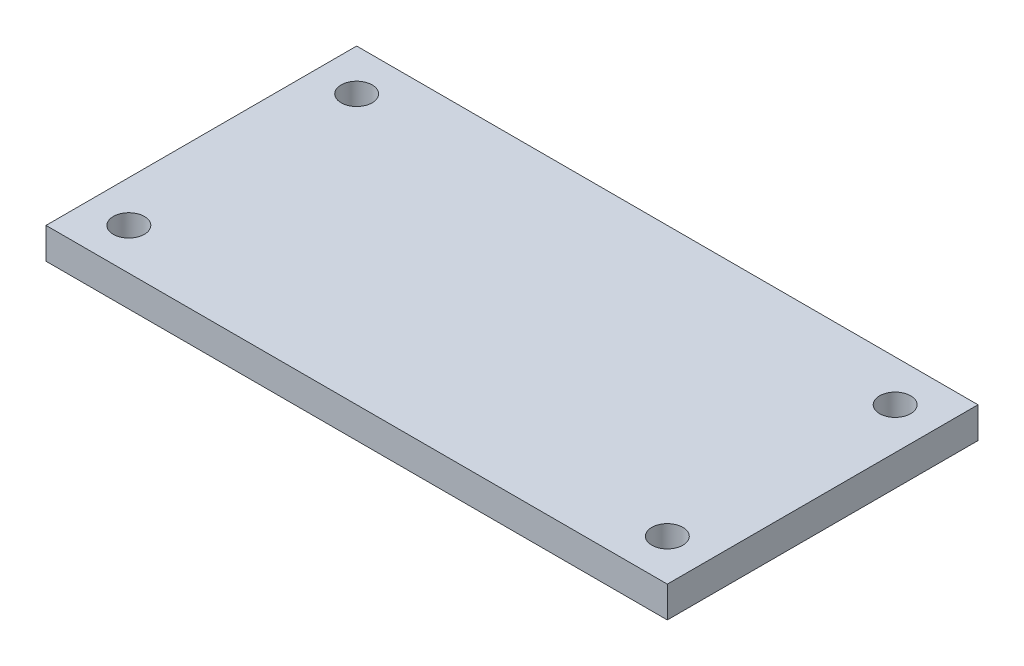
ISO-10303-21;
HEADER;
FILE_DESCRIPTION(('STEP AP214'),'2;1');
FILE_NAME('part.step','',(''),(''),'','','');
FILE_SCHEMA(('AUTOMOTIVE_DESIGN { 1 0 10303 214 1 1 1 1 }'));
ENDSEC;
DATA;
#1=APPLICATION_CONTEXT('core data for automotive mechanical design processes');
#2=APPLICATION_PROTOCOL_DEFINITION('international standard','automotive_design',2000,#1);
#3=PRODUCT_CONTEXT('',#1,'mechanical');
#4=PRODUCT('Part','Part','',(#3));
#5=PRODUCT_RELATED_PRODUCT_CATEGORY('part','',(#4));
#6=PRODUCT_DEFINITION_FORMATION('','',#4);
#7=PRODUCT_DEFINITION_CONTEXT('part definition',#1,'design');
#8=PRODUCT_DEFINITION('design','',#6,#7);
#9=PRODUCT_DEFINITION_SHAPE('','',#8);
#10=(LENGTH_UNIT() NAMED_UNIT(*) SI_UNIT(.MILLI.,.METRE.));
#11=(NAMED_UNIT(*) PLANE_ANGLE_UNIT() SI_UNIT($,.RADIAN.));
#12=(NAMED_UNIT(*) SI_UNIT($,.STERADIAN.) SOLID_ANGLE_UNIT());
#13=UNCERTAINTY_MEASURE_WITH_UNIT(LENGTH_MEASURE(1.E-05),#10,'distance_accuracy_value','');
#14=(GEOMETRIC_REPRESENTATION_CONTEXT(3) GLOBAL_UNCERTAINTY_ASSIGNED_CONTEXT((#13)) GLOBAL_UNIT_ASSIGNED_CONTEXT((#10,
#11,#12)) REPRESENTATION_CONTEXT('',''));
#15=CARTESIAN_POINT('',(0.,0.,0.));
#16=DIRECTION('',(0.,0.,1.));
#17=DIRECTION('',(1.,0.,0.));
#18=AXIS2_PLACEMENT_3D('',#15,#16,#17);
#19=CARTESIAN_POINT('',(0.,3.,0.));
#20=DIRECTION('',(0.,-1.,0.));
#21=DIRECTION('',(0.,0.,-1.));
#22=AXIS2_PLACEMENT_3D('',#19,#20,#21);
#23=PLANE('',#22);
#24=DIRECTION('',(0.,0.,1.));
#25=VECTOR('',#24,1.);
#26=CARTESIAN_POINT('',(-30.,3.,15.));
#27=LINE('',#26,#25);
#28=CARTESIAN_POINT('',(-30.,3.,-15.));
#29=VERTEX_POINT('',#28);
#30=CARTESIAN_POINT('',(-30.,3.,15.));
#31=VERTEX_POINT('',#30);
#32=EDGE_CURVE('E88',#29,#31,#27,.T.);
#33=ORIENTED_EDGE('',*,*,#32,.T.);
#34=DIRECTION('',(1.,0.,0.));
#35=VECTOR('',#34,1.);
#36=CARTESIAN_POINT('',(-14.2622950819648,3.,15.));
#37=LINE('',#36,#35);
#38=CARTESIAN_POINT('',(30.,3.,15.));
#39=VERTEX_POINT('',#38);
#40=EDGE_CURVE('E83',#31,#39,#37,.T.);
#41=ORIENTED_EDGE('',*,*,#40,.T.);
#42=DIRECTION('',(0.,0.,-1.));
#43=VECTOR('',#42,1.);
#44=CARTESIAN_POINT('',(30.,3.,0.));
#45=LINE('',#44,#43);
#46=CARTESIAN_POINT('',(30.,3.,-15.));
#47=VERTEX_POINT('',#46);
#48=EDGE_CURVE('E86',#39,#47,#45,.T.);
#49=ORIENTED_EDGE('',*,*,#48,.T.);
#50=DIRECTION('',(-1.,0.,0.));
#51=VECTOR('',#50,1.);
#52=CARTESIAN_POINT('',(0.,3.,-15.));
#53=LINE('',#52,#51);
#54=EDGE_CURVE('E55',#47,#29,#53,.T.);
#55=ORIENTED_EDGE('',*,*,#54,.T.);
#56=EDGE_LOOP('',(#33,#41,#49,#55));
#57=FACE_BOUND('',#56,.T.);
#58=CARTESIAN_POINT('',(-26.,3.,-11.));
#59=DIRECTION('',(0.,1.,0.));
#60=DIRECTION('',(0.,0.,1.));
#61=AXIS2_PLACEMENT_3D('',#58,#59,#60);
#62=CIRCLE('',#61,1.5);
#63=CARTESIAN_POINT('',(-26.,3.,-9.5));
#64=VERTEX_POINT('',#63);
#65=EDGE_CURVE('E104',#64,#64,#62,.T.);
#66=ORIENTED_EDGE('',*,*,#65,.F.);
#67=EDGE_LOOP('',(#66));
#68=FACE_BOUND('',#67,.T.);
#69=CARTESIAN_POINT('',(26.,3.,-11.));
#70=DIRECTION('',(0.,1.,0.));
#71=DIRECTION('',(0.,0.,-1.));
#72=AXIS2_PLACEMENT_3D('',#69,#70,#71);
#73=CIRCLE('',#72,1.5);
#74=CARTESIAN_POINT('',(26.,3.,-12.5));
#75=VERTEX_POINT('',#74);
#76=EDGE_CURVE('E138',#75,#75,#73,.T.);
#77=ORIENTED_EDGE('',*,*,#76,.F.);
#78=EDGE_LOOP('',(#77));
#79=FACE_BOUND('',#78,.T.);
#80=CARTESIAN_POINT('',(26.,3.,11.));
#81=DIRECTION('',(0.,1.,0.));
#82=DIRECTION('',(0.,0.,1.));
#83=AXIS2_PLACEMENT_3D('',#80,#81,#82);
#84=CIRCLE('',#83,1.5);
#85=CARTESIAN_POINT('',(26.,3.,12.5));
#86=VERTEX_POINT('',#85);
#87=EDGE_CURVE('E133',#86,#86,#84,.T.);
#88=ORIENTED_EDGE('',*,*,#87,.F.);
#89=EDGE_LOOP('',(#88));
#90=FACE_BOUND('',#89,.T.);
#91=CARTESIAN_POINT('',(-26.,3.,11.));
#92=DIRECTION('',(0.,1.,0.));
#93=DIRECTION('',(0.,0.,-1.));
#94=AXIS2_PLACEMENT_3D('',#91,#92,#93);
#95=CIRCLE('',#94,1.5);
#96=CARTESIAN_POINT('',(-26.,3.,9.5));
#97=VERTEX_POINT('',#96);
#98=EDGE_CURVE('E127',#97,#97,#95,.T.);
#99=ORIENTED_EDGE('',*,*,#98,.F.);
#100=EDGE_LOOP('',(#99));
#101=FACE_BOUND('',#100,.T.);
#102=ADVANCED_FACE('F38',(#57,#68,#79,#90,#101),#23,.F.);
#103=CARTESIAN_POINT('',(0.,0.,0.));
#104=DIRECTION('',(0.,-1.,0.));
#105=DIRECTION('',(0.,0.,-1.));
#106=AXIS2_PLACEMENT_3D('',#103,#104,#105);
#107=PLANE('',#106);
#108=CARTESIAN_POINT('',(26.,0.,11.));
#109=DIRECTION('',(0.,1.,0.));
#110=DIRECTION('',(0.,0.,1.));
#111=AXIS2_PLACEMENT_3D('',#108,#109,#110);
#112=CIRCLE('',#111,1.5);
#113=CARTESIAN_POINT('',(26.,0.,12.5));
#114=VERTEX_POINT('',#113);
#115=EDGE_CURVE('E130',#114,#114,#112,.T.);
#116=ORIENTED_EDGE('',*,*,#115,.T.);
#117=EDGE_LOOP('',(#116));
#118=FACE_BOUND('',#117,.T.);
#119=CARTESIAN_POINT('',(-26.,0.,-11.));
#120=DIRECTION('',(0.,1.,0.));
#121=DIRECTION('',(0.,0.,1.));
#122=AXIS2_PLACEMENT_3D('',#119,#120,#121);
#123=CIRCLE('',#122,1.5);
#124=CARTESIAN_POINT('',(-26.,0.,-9.5));
#125=VERTEX_POINT('',#124);
#126=EDGE_CURVE('E141',#125,#125,#123,.T.);
#127=ORIENTED_EDGE('',*,*,#126,.T.);
#128=EDGE_LOOP('',(#127));
#129=FACE_BOUND('',#128,.T.);
#130=DIRECTION('',(1.,0.,0.));
#131=VECTOR('',#130,1.);
#132=CARTESIAN_POINT('',(30.,0.,15.));
#133=LINE('',#132,#131);
#134=CARTESIAN_POINT('',(-30.,0.,15.));
#135=VERTEX_POINT('',#134);
#136=CARTESIAN_POINT('',(30.,0.,15.));
#137=VERTEX_POINT('',#136);
#138=EDGE_CURVE('E93',#135,#137,#133,.T.);
#139=ORIENTED_EDGE('',*,*,#138,.F.);
#140=DIRECTION('',(0.,0.,1.));
#141=VECTOR('',#140,1.);
#142=CARTESIAN_POINT('',(-30.,0.,0.));
#143=LINE('',#142,#141);
#144=CARTESIAN_POINT('',(-30.,0.,-15.));
#145=VERTEX_POINT('',#144);
#146=EDGE_CURVE('E107',#145,#135,#143,.T.);
#147=ORIENTED_EDGE('',*,*,#146,.F.);
#148=DIRECTION('',(-1.,0.,0.));
#149=VECTOR('',#148,1.);
#150=CARTESIAN_POINT('',(-30.,0.,-15.));
#151=LINE('',#150,#149);
#152=CARTESIAN_POINT('',(30.,0.,-15.));
#153=VERTEX_POINT('',#152);
#154=EDGE_CURVE('E71',#153,#145,#151,.T.);
#155=ORIENTED_EDGE('',*,*,#154,.F.);
#156=DIRECTION('',(0.,0.,-1.));
#157=VECTOR('',#156,1.);
#158=CARTESIAN_POINT('',(30.,0.,-15.));
#159=LINE('',#158,#157);
#160=EDGE_CURVE('E103',#137,#153,#159,.T.);
#161=ORIENTED_EDGE('',*,*,#160,.F.);
#162=EDGE_LOOP('',(#139,#147,#155,#161));
#163=FACE_BOUND('',#162,.T.);
#164=CARTESIAN_POINT('',(26.,0.,-11.));
#165=DIRECTION('',(0.,1.,0.));
#166=DIRECTION('',(0.,0.,-1.));
#167=AXIS2_PLACEMENT_3D('',#164,#165,#166);
#168=CIRCLE('',#167,1.5);
#169=CARTESIAN_POINT('',(26.,0.,-12.5));
#170=VERTEX_POINT('',#169);
#171=EDGE_CURVE('E122',#170,#170,#168,.T.);
#172=ORIENTED_EDGE('',*,*,#171,.T.);
#173=EDGE_LOOP('',(#172));
#174=FACE_BOUND('',#173,.T.);
#175=CARTESIAN_POINT('',(-26.,0.,11.));
#176=DIRECTION('',(0.,1.,0.));
#177=DIRECTION('',(0.,0.,-1.));
#178=AXIS2_PLACEMENT_3D('',#175,#176,#177);
#179=CIRCLE('',#178,1.5);
#180=CARTESIAN_POINT('',(-26.,0.,9.5));
#181=VERTEX_POINT('',#180);
#182=EDGE_CURVE('E125',#181,#181,#179,.T.);
#183=ORIENTED_EDGE('',*,*,#182,.T.);
#184=EDGE_LOOP('',(#183));
#185=FACE_BOUND('',#184,.T.);
#186=ADVANCED_FACE('F114',(#118,#129,#163,#174,#185),#107,.T.);
#187=CARTESIAN_POINT('',(30.,3.,15.));
#188=DIRECTION('',(0.,0.,-1.));
#189=DIRECTION('',(-1.,0.,0.));
#190=AXIS2_PLACEMENT_3D('',#187,#188,#189);
#191=PLANE('',#190);
#192=ORIENTED_EDGE('',*,*,#138,.T.);
#193=DIRECTION('',(0.,-1.,0.));
#194=VECTOR('',#193,1.);
#195=CARTESIAN_POINT('',(30.,3.,15.));
#196=LINE('',#195,#194);
#197=EDGE_CURVE('E47',#39,#137,#196,.T.);
#198=ORIENTED_EDGE('',*,*,#197,.F.);
#199=ORIENTED_EDGE('',*,*,#40,.F.);
#200=DIRECTION('',(0.,-1.,0.));
#201=VECTOR('',#200,1.);
#202=CARTESIAN_POINT('',(-30.,3.,15.));
#203=LINE('',#202,#201);
#204=EDGE_CURVE('E11',#31,#135,#203,.T.);
#205=ORIENTED_EDGE('',*,*,#204,.T.);
#206=EDGE_LOOP('',(#192,#198,#199,#205));
#207=FACE_BOUND('',#206,.T.);
#208=ADVANCED_FACE('F40',(#207),#191,.F.);
#209=CARTESIAN_POINT('',(30.,3.,-15.));
#210=DIRECTION('',(-1.,0.,0.));
#211=DIRECTION('',(0.,0.,1.));
#212=AXIS2_PLACEMENT_3D('',#209,#210,#211);
#213=PLANE('',#212);
#214=ORIENTED_EDGE('',*,*,#160,.T.);
#215=DIRECTION('',(0.,-1.,0.));
#216=VECTOR('',#215,1.);
#217=CARTESIAN_POINT('',(30.,3.,-15.));
#218=LINE('',#217,#216);
#219=EDGE_CURVE('E95',#47,#153,#218,.T.);
#220=ORIENTED_EDGE('',*,*,#219,.F.);
#221=ORIENTED_EDGE('',*,*,#48,.F.);
#222=ORIENTED_EDGE('',*,*,#197,.T.);
#223=EDGE_LOOP('',(#214,#220,#221,#222));
#224=FACE_BOUND('',#223,.T.);
#225=ADVANCED_FACE('F96',(#224),#213,.F.);
#226=CARTESIAN_POINT('',(-30.,3.,-15.));
#227=DIRECTION('',(0.,0.,1.));
#228=DIRECTION('',(1.,0.,0.));
#229=AXIS2_PLACEMENT_3D('',#226,#227,#228);
#230=PLANE('',#229);
#231=ORIENTED_EDGE('',*,*,#154,.T.);
#232=DIRECTION('',(0.,-1.,0.));
#233=VECTOR('',#232,1.);
#234=CARTESIAN_POINT('',(-30.,3.,-15.));
#235=LINE('',#234,#233);
#236=EDGE_CURVE('E98',#29,#145,#235,.T.);
#237=ORIENTED_EDGE('',*,*,#236,.F.);
#238=ORIENTED_EDGE('',*,*,#54,.F.);
#239=ORIENTED_EDGE('',*,*,#219,.T.);
#240=EDGE_LOOP('',(#231,#237,#238,#239));
#241=FACE_BOUND('',#240,.T.);
#242=ADVANCED_FACE('F111',(#241),#230,.F.);
#243=CARTESIAN_POINT('',(-30.,3.,0.));
#244=DIRECTION('',(1.,0.,0.));
#245=DIRECTION('',(0.,0.,-1.));
#246=AXIS2_PLACEMENT_3D('',#243,#244,#245);
#247=PLANE('',#246);
#248=ORIENTED_EDGE('',*,*,#146,.T.);
#249=ORIENTED_EDGE('',*,*,#204,.F.);
#250=ORIENTED_EDGE('',*,*,#32,.F.);
#251=ORIENTED_EDGE('',*,*,#236,.T.);
#252=EDGE_LOOP('',(#248,#249,#250,#251));
#253=FACE_BOUND('',#252,.T.);
#254=ADVANCED_FACE('F113',(#253),#247,.F.);
#255=CARTESIAN_POINT('',(-26.,3.,-11.));
#256=DIRECTION('',(0.,-1.,0.));
#257=DIRECTION('',(0.,0.,-1.));
#258=AXIS2_PLACEMENT_3D('',#255,#256,#257);
#259=CYLINDRICAL_SURFACE('',#258,1.5);
#260=ORIENTED_EDGE('',*,*,#65,.T.);
#261=EDGE_LOOP('',(#260));
#262=FACE_BOUND('',#261,.T.);
#263=ORIENTED_EDGE('',*,*,#126,.F.);
#264=EDGE_LOOP('',(#263));
#265=FACE_BOUND('',#264,.T.);
#266=ADVANCED_FACE('F149',(#262,#265),#259,.F.);
#267=CARTESIAN_POINT('',(26.,3.,-11.));
#268=DIRECTION('',(0.,-1.,0.));
#269=DIRECTION('',(0.,0.,-1.));
#270=AXIS2_PLACEMENT_3D('',#267,#268,#269);
#271=CYLINDRICAL_SURFACE('',#270,1.5);
#272=ORIENTED_EDGE('',*,*,#76,.T.);
#273=EDGE_LOOP('',(#272));
#274=FACE_BOUND('',#273,.T.);
#275=ORIENTED_EDGE('',*,*,#171,.F.);
#276=EDGE_LOOP('',(#275));
#277=FACE_BOUND('',#276,.T.);
#278=ADVANCED_FACE('F151',(#274,#277),#271,.F.);
#279=CARTESIAN_POINT('',(26.,3.,11.));
#280=DIRECTION('',(0.,-1.,0.));
#281=DIRECTION('',(0.,0.,-1.));
#282=AXIS2_PLACEMENT_3D('',#279,#280,#281);
#283=CYLINDRICAL_SURFACE('',#282,1.5);
#284=ORIENTED_EDGE('',*,*,#87,.T.);
#285=EDGE_LOOP('',(#284));
#286=FACE_BOUND('',#285,.T.);
#287=ORIENTED_EDGE('',*,*,#115,.F.);
#288=EDGE_LOOP('',(#287));
#289=FACE_BOUND('',#288,.T.);
#290=ADVANCED_FACE('F158',(#286,#289),#283,.F.);
#291=CARTESIAN_POINT('',(-26.,3.,11.));
#292=DIRECTION('',(0.,-1.,0.));
#293=DIRECTION('',(0.,0.,-1.));
#294=AXIS2_PLACEMENT_3D('',#291,#292,#293);
#295=CYLINDRICAL_SURFACE('',#294,1.5);
#296=ORIENTED_EDGE('',*,*,#98,.T.);
#297=EDGE_LOOP('',(#296));
#298=FACE_BOUND('',#297,.T.);
#299=ORIENTED_EDGE('',*,*,#182,.F.);
#300=EDGE_LOOP('',(#299));
#301=FACE_BOUND('',#300,.T.);
#302=ADVANCED_FACE('F218',(#298,#301),#295,.F.);
#303=CLOSED_SHELL('',(#102,#186,#208,#225,#242,#254,#266,#278,#290,#302));
#304=MANIFOLD_SOLID_BREP('B2',#303);
#305=ADVANCED_BREP_SHAPE_REPRESENTATION('',(#18,#304),#14);
#306=SHAPE_DEFINITION_REPRESENTATION(#9,#305);
ENDSEC;
END-ISO-10303-21;
